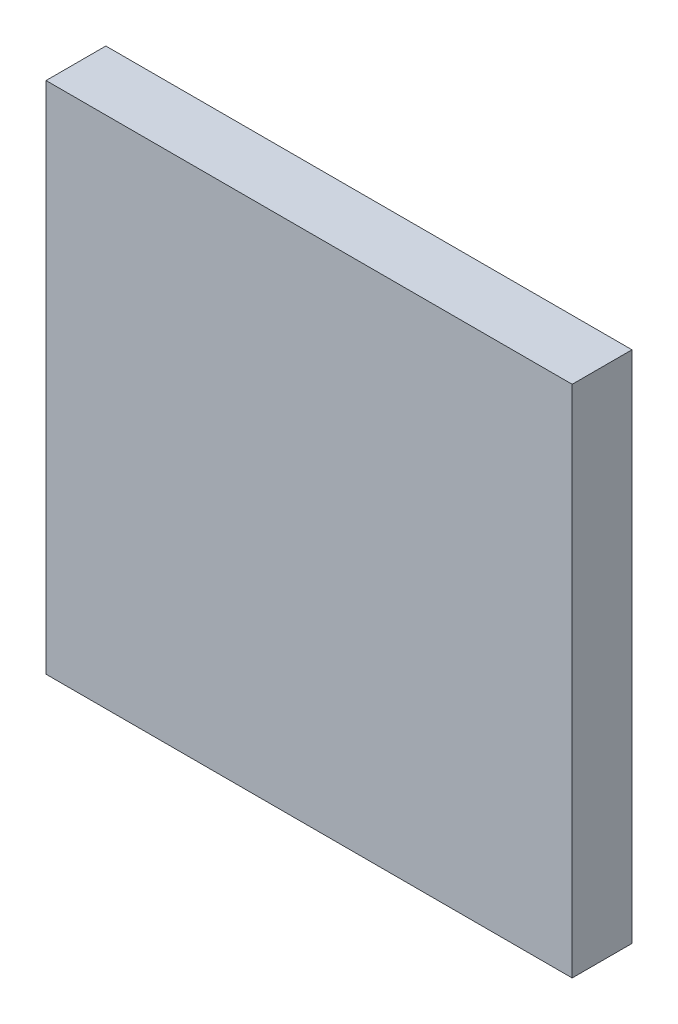
ISO-10303-21;
HEADER;
FILE_DESCRIPTION(('STEP AP214'),'2;1');
FILE_NAME('part.step','',(''),(''),'','','');
FILE_SCHEMA(('AUTOMOTIVE_DESIGN { 1 0 10303 214 1 1 1 1 }'));
ENDSEC;
DATA;
#1=APPLICATION_CONTEXT('core data for automotive mechanical design processes');
#2=APPLICATION_PROTOCOL_DEFINITION('international standard','automotive_design',2000,#1);
#3=PRODUCT_CONTEXT('',#1,'mechanical');
#4=PRODUCT('Part','Part','',(#3));
#5=PRODUCT_RELATED_PRODUCT_CATEGORY('part','',(#4));
#6=PRODUCT_DEFINITION_FORMATION('','',#4);
#7=PRODUCT_DEFINITION_CONTEXT('part definition',#1,'design');
#8=PRODUCT_DEFINITION('design','',#6,#7);
#9=PRODUCT_DEFINITION_SHAPE('','',#8);
#10=(LENGTH_UNIT() NAMED_UNIT(*) SI_UNIT(.MILLI.,.METRE.));
#11=(NAMED_UNIT(*) PLANE_ANGLE_UNIT() SI_UNIT($,.RADIAN.));
#12=(NAMED_UNIT(*) SI_UNIT($,.STERADIAN.) SOLID_ANGLE_UNIT());
#13=UNCERTAINTY_MEASURE_WITH_UNIT(LENGTH_MEASURE(1.E-05),#10,'distance_accuracy_value','');
#14=(GEOMETRIC_REPRESENTATION_CONTEXT(3) GLOBAL_UNCERTAINTY_ASSIGNED_CONTEXT((#13)) GLOBAL_UNIT_ASSIGNED_CONTEXT((#10,
#11,#12)) REPRESENTATION_CONTEXT('',''));
#15=CARTESIAN_POINT('',(0.,0.,0.));
#16=DIRECTION('',(0.,0.,1.));
#17=DIRECTION('',(1.,0.,0.));
#18=AXIS2_PLACEMENT_3D('',#15,#16,#17);
#19=CARTESIAN_POINT('',(0.,0.,10.));
#20=DIRECTION('',(1.,0.,0.));
#21=DIRECTION('',(0.,0.,-1.));
#22=AXIS2_PLACEMENT_3D('',#19,#20,#21);
#23=PLANE('',#22);
#24=DIRECTION('',(0.,-1.,0.));
#25=VECTOR('',#24,1.);
#26=CARTESIAN_POINT('',(0.,0.,0.));
#27=LINE('',#26,#25);
#28=CARTESIAN_POINT('',(0.,86.,0.));
#29=VERTEX_POINT('',#28);
#30=CARTESIAN_POINT('',(0.,0.,0.));
#31=VERTEX_POINT('',#30);
#32=EDGE_CURVE('E107',#29,#31,#27,.T.);
#33=ORIENTED_EDGE('',*,*,#32,.T.);
#34=DIRECTION('',(0.,0.,-1.));
#35=VECTOR('',#34,1.);
#36=CARTESIAN_POINT('',(0.,0.,10.));
#37=LINE('',#36,#35);
#38=CARTESIAN_POINT('',(0.,0.,10.));
#39=VERTEX_POINT('',#38);
#40=EDGE_CURVE('E11',#39,#31,#37,.T.);
#41=ORIENTED_EDGE('',*,*,#40,.F.);
#42=DIRECTION('',(0.,-1.,0.));
#43=VECTOR('',#42,1.);
#44=CARTESIAN_POINT('',(0.,0.,10.));
#45=LINE('',#44,#43);
#46=CARTESIAN_POINT('',(0.,86.,10.));
#47=VERTEX_POINT('',#46);
#48=EDGE_CURVE('E91',#47,#39,#45,.T.);
#49=ORIENTED_EDGE('',*,*,#48,.F.);
#50=DIRECTION('',(0.,0.,-1.));
#51=VECTOR('',#50,1.);
#52=CARTESIAN_POINT('',(0.,86.,10.));
#53=LINE('',#52,#51);
#54=EDGE_CURVE('E103',#47,#29,#53,.T.);
#55=ORIENTED_EDGE('',*,*,#54,.T.);
#56=EDGE_LOOP('',(#33,#41,#49,#55));
#57=FACE_BOUND('',#56,.T.);
#58=ADVANCED_FACE('F39',(#57),#23,.F.);
#59=CARTESIAN_POINT('',(0.,0.,10.));
#60=DIRECTION('',(0.,1.,0.));
#61=DIRECTION('',(0.,0.,1.));
#62=AXIS2_PLACEMENT_3D('',#59,#60,#61);
#63=PLANE('',#62);
#64=DIRECTION('',(1.,0.,0.));
#65=VECTOR('',#64,1.);
#66=CARTESIAN_POINT('',(0.,0.,0.));
#67=LINE('',#66,#65);
#68=CARTESIAN_POINT('',(88.,0.,0.));
#69=VERTEX_POINT('',#68);
#70=EDGE_CURVE('E96',#31,#69,#67,.T.);
#71=ORIENTED_EDGE('',*,*,#70,.T.);
#72=DIRECTION('',(0.,0.,-1.));
#73=VECTOR('',#72,1.);
#74=CARTESIAN_POINT('',(88.,0.,10.));
#75=LINE('',#74,#73);
#76=CARTESIAN_POINT('',(88.,0.,10.));
#77=VERTEX_POINT('',#76);
#78=EDGE_CURVE('E48',#77,#69,#75,.T.);
#79=ORIENTED_EDGE('',*,*,#78,.F.);
#80=DIRECTION('',(1.,0.,0.));
#81=VECTOR('',#80,1.);
#82=CARTESIAN_POINT('',(0.,0.,10.));
#83=LINE('',#82,#81);
#84=EDGE_CURVE('E86',#39,#77,#83,.T.);
#85=ORIENTED_EDGE('',*,*,#84,.F.);
#86=ORIENTED_EDGE('',*,*,#40,.T.);
#87=EDGE_LOOP('',(#71,#79,#85,#86));
#88=FACE_BOUND('',#87,.T.);
#89=ADVANCED_FACE('F95',(#88),#63,.F.);
#90=CARTESIAN_POINT('',(88.,0.,10.));
#91=DIRECTION('',(-1.,0.,0.));
#92=DIRECTION('',(0.,0.,1.));
#93=AXIS2_PLACEMENT_3D('',#90,#91,#92);
#94=PLANE('',#93);
#95=DIRECTION('',(0.,1.,0.));
#96=VECTOR('',#95,1.);
#97=CARTESIAN_POINT('',(88.,0.,0.));
#98=LINE('',#97,#96);
#99=CARTESIAN_POINT('',(88.,86.,0.));
#100=VERTEX_POINT('',#99);
#101=EDGE_CURVE('E73',#69,#100,#98,.T.);
#102=ORIENTED_EDGE('',*,*,#101,.T.);
#103=DIRECTION('',(0.,0.,-1.));
#104=VECTOR('',#103,1.);
#105=CARTESIAN_POINT('',(88.,86.,10.));
#106=LINE('',#105,#104);
#107=CARTESIAN_POINT('',(88.,86.,10.));
#108=VERTEX_POINT('',#107);
#109=EDGE_CURVE('E98',#108,#100,#106,.T.);
#110=ORIENTED_EDGE('',*,*,#109,.F.);
#111=DIRECTION('',(0.,1.,0.));
#112=VECTOR('',#111,1.);
#113=CARTESIAN_POINT('',(88.,0.,10.));
#114=LINE('',#113,#112);
#115=EDGE_CURVE('E89',#77,#108,#114,.T.);
#116=ORIENTED_EDGE('',*,*,#115,.F.);
#117=ORIENTED_EDGE('',*,*,#78,.T.);
#118=EDGE_LOOP('',(#102,#110,#116,#117));
#119=FACE_BOUND('',#118,.T.);
#120=ADVANCED_FACE('F99',(#119),#94,.F.);
#121=CARTESIAN_POINT('',(0.,86.,10.));
#122=DIRECTION('',(0.,-1.,0.));
#123=DIRECTION('',(0.,0.,-1.));
#124=AXIS2_PLACEMENT_3D('',#121,#122,#123);
#125=PLANE('',#124);
#126=DIRECTION('',(-1.,0.,0.));
#127=VECTOR('',#126,1.);
#128=CARTESIAN_POINT('',(0.,86.,0.));
#129=LINE('',#128,#127);
#130=EDGE_CURVE('E79',#100,#29,#129,.T.);
#131=ORIENTED_EDGE('',*,*,#130,.T.);
#132=ORIENTED_EDGE('',*,*,#54,.F.);
#133=DIRECTION('',(-1.,0.,0.));
#134=VECTOR('',#133,1.);
#135=CARTESIAN_POINT('',(0.,86.,10.));
#136=LINE('',#135,#134);
#137=EDGE_CURVE('E56',#108,#47,#136,.T.);
#138=ORIENTED_EDGE('',*,*,#137,.F.);
#139=ORIENTED_EDGE('',*,*,#109,.T.);
#140=EDGE_LOOP('',(#131,#132,#138,#139));
#141=FACE_BOUND('',#140,.T.);
#142=ADVANCED_FACE('F120',(#141),#125,.F.);
#143=CARTESIAN_POINT('',(0.,0.,10.));
#144=DIRECTION('',(0.,0.,-1.));
#145=DIRECTION('',(-1.,0.,0.));
#146=AXIS2_PLACEMENT_3D('',#143,#144,#145);
#147=PLANE('',#146);
#148=ORIENTED_EDGE('',*,*,#48,.T.);
#149=ORIENTED_EDGE('',*,*,#84,.T.);
#150=ORIENTED_EDGE('',*,*,#115,.T.);
#151=ORIENTED_EDGE('',*,*,#137,.T.);
#152=EDGE_LOOP('',(#148,#149,#150,#151));
#153=FACE_BOUND('',#152,.T.);
#154=ADVANCED_FACE('F87',(#153),#147,.F.);
#155=CARTESIAN_POINT('',(0.,0.,0.));
#156=DIRECTION('',(0.,0.,-1.));
#157=DIRECTION('',(-1.,0.,0.));
#158=AXIS2_PLACEMENT_3D('',#155,#156,#157);
#159=PLANE('',#158);
#160=ORIENTED_EDGE('',*,*,#32,.F.);
#161=ORIENTED_EDGE('',*,*,#130,.F.);
#162=ORIENTED_EDGE('',*,*,#101,.F.);
#163=ORIENTED_EDGE('',*,*,#70,.F.);
#164=EDGE_LOOP('',(#160,#161,#162,#163));
#165=FACE_BOUND('',#164,.T.);
#166=ADVANCED_FACE('F123',(#165),#159,.T.);
#167=CLOSED_SHELL('',(#58,#89,#120,#142,#154,#166));
#168=MANIFOLD_SOLID_BREP('B2',#167);
#169=ADVANCED_BREP_SHAPE_REPRESENTATION('',(#18,#168),#14);
#170=SHAPE_DEFINITION_REPRESENTATION(#9,#169);
ENDSEC;
END-ISO-10303-21;
